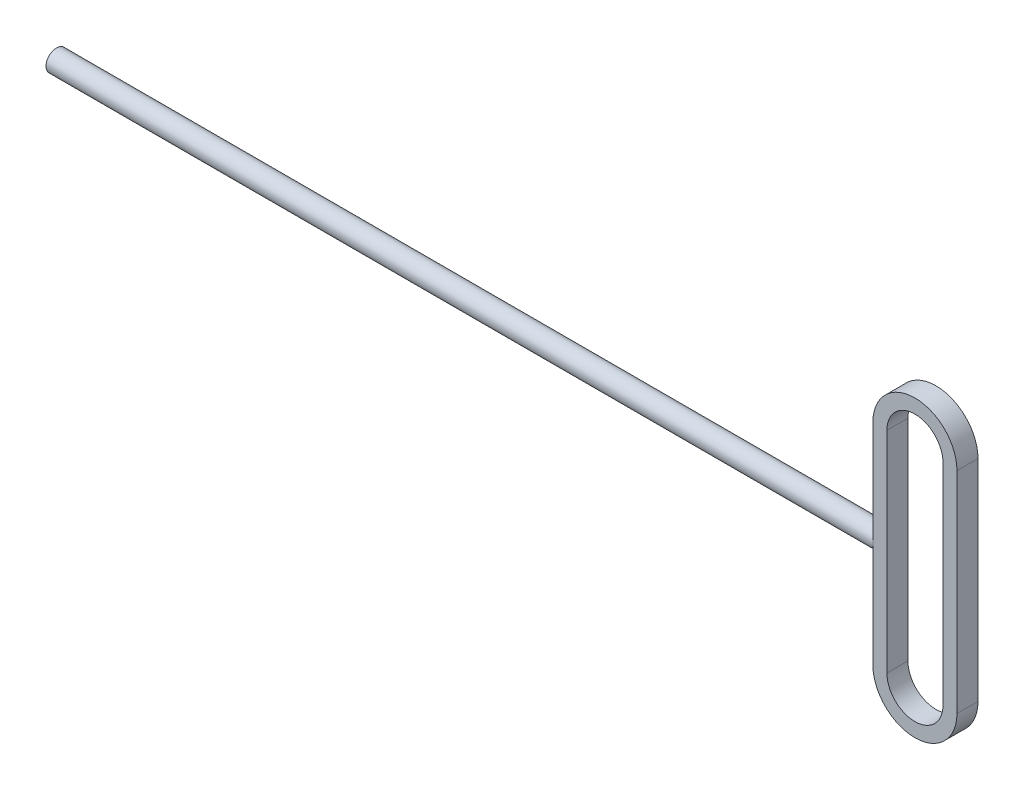
ISO-10303-21;
HEADER;
FILE_DESCRIPTION(('STEP AP214'),'2;1');
FILE_NAME('part.step','',(''),(''),'','','');
FILE_SCHEMA(('AUTOMOTIVE_DESIGN { 1 0 10303 214 1 1 1 1 }'));
ENDSEC;
DATA;
#1=APPLICATION_CONTEXT('core data for automotive mechanical design processes');
#2=APPLICATION_PROTOCOL_DEFINITION('international standard','automotive_design',2000,#1);
#3=PRODUCT_CONTEXT('',#1,'mechanical');
#4=PRODUCT('Part','Part','',(#3));
#5=PRODUCT_RELATED_PRODUCT_CATEGORY('part','',(#4));
#6=PRODUCT_DEFINITION_FORMATION('','',#4);
#7=PRODUCT_DEFINITION_CONTEXT('part definition',#1,'design');
#8=PRODUCT_DEFINITION('design','',#6,#7);
#9=PRODUCT_DEFINITION_SHAPE('','',#8);
#10=(LENGTH_UNIT() NAMED_UNIT(*) SI_UNIT(.MILLI.,.METRE.));
#11=(NAMED_UNIT(*) PLANE_ANGLE_UNIT() SI_UNIT($,.RADIAN.));
#12=(NAMED_UNIT(*) SI_UNIT($,.STERADIAN.) SOLID_ANGLE_UNIT());
#13=UNCERTAINTY_MEASURE_WITH_UNIT(LENGTH_MEASURE(1.E-05),#10,'distance_accuracy_value','');
#14=(GEOMETRIC_REPRESENTATION_CONTEXT(3) GLOBAL_UNCERTAINTY_ASSIGNED_CONTEXT((#13)) GLOBAL_UNIT_ASSIGNED_CONTEXT((#10,
#11,#12)) REPRESENTATION_CONTEXT('',''));
#15=CARTESIAN_POINT('',(0.,0.,0.));
#16=DIRECTION('',(0.,0.,1.));
#17=DIRECTION('',(1.,0.,0.));
#18=AXIS2_PLACEMENT_3D('',#15,#16,#17);
#19=CARTESIAN_POINT('',(-2.,-29.7611568837199,3.));
#20=DIRECTION('',(1.,0.,0.));
#21=DIRECTION('',(0.,1.,0.));
#22=AXIS2_PLACEMENT_3D('',#19,#20,#21);
#23=PLANE('',#22);
#24=CARTESIAN_POINT('',(-2.,-44.7611568837199,1.5));
#25=DIRECTION('',(1.,0.,0.));
#26=DIRECTION('',(0.,1.,0.));
#27=AXIS2_PLACEMENT_3D('',#24,#25,#26);
#28=CIRCLE('',#27,1.5);
#29=CARTESIAN_POINT('',(-2.,-44.7611568837199,0.));
#30=VERTEX_POINT('',#29);
#31=CARTESIAN_POINT('',(-2.,-44.7611568837199,3.));
#32=VERTEX_POINT('',#31);
#33=EDGE_CURVE('E124',#30,#32,#28,.F.);
#34=ORIENTED_EDGE('',*,*,#33,.F.);
#35=DIRECTION('',(0.,-1.,0.));
#36=VECTOR('',#35,1.);
#37=CARTESIAN_POINT('',(-2.,-29.7611568837199,0.));
#38=LINE('',#37,#36);
#39=CARTESIAN_POINT('',(-2.00000000000001,-59.7611568837199,0.));
#40=VERTEX_POINT('',#39);
#41=EDGE_CURVE('E113',#30,#40,#38,.T.);
#42=ORIENTED_EDGE('',*,*,#41,.T.);
#43=DIRECTION('',(0.,0.,-1.));
#44=VECTOR('',#43,1.);
#45=CARTESIAN_POINT('',(-2.00000000000001,-59.7611568837199,3.));
#46=LINE('',#45,#44);
#47=CARTESIAN_POINT('',(-2.00000000000001,-59.7611568837199,3.));
#48=VERTEX_POINT('',#47);
#49=EDGE_CURVE('E45',#48,#40,#46,.T.);
#50=ORIENTED_EDGE('',*,*,#49,.F.);
#51=DIRECTION('',(0.,-1.,0.));
#52=VECTOR('',#51,1.);
#53=CARTESIAN_POINT('',(-2.,-29.7611568837199,3.));
#54=LINE('',#53,#52);
#55=EDGE_CURVE('E125',#32,#48,#54,.T.);
#56=ORIENTED_EDGE('',*,*,#55,.F.);
#57=EDGE_LOOP('',(#34,#42,#50,#56));
#58=FACE_BOUND('',#57,.T.);
#59=ADVANCED_FACE('F37',(#58),#23,.F.);
#60=EDGE_CURVE('E52',#32,#30,#28,.F.);
#61=ORIENTED_EDGE('',*,*,#60,.F.);
#62=CARTESIAN_POINT('',(-2.,-29.7611568837199,3.));
#63=VERTEX_POINT('',#62);
#64=EDGE_CURVE('E166',#63,#32,#54,.T.);
#65=ORIENTED_EDGE('',*,*,#64,.F.);
#66=DIRECTION('',(0.,0.,-1.));
#67=VECTOR('',#66,1.);
#68=CARTESIAN_POINT('',(-2.,-29.7611568837199,3.));
#69=LINE('',#68,#67);
#70=CARTESIAN_POINT('',(-2.,-29.7611568837199,0.));
#71=VERTEX_POINT('',#70);
#72=EDGE_CURVE('E12',#63,#71,#69,.T.);
#73=ORIENTED_EDGE('',*,*,#72,.T.);
#74=EDGE_CURVE('E105',#71,#30,#38,.T.);
#75=ORIENTED_EDGE('',*,*,#74,.T.);
#76=EDGE_LOOP('',(#61,#65,#73,#75));
#77=FACE_BOUND('',#76,.T.);
#78=ADVANCED_FACE('F107',(#77),#23,.F.);
#79=CARTESIAN_POINT('',(4.,-29.7611568837199,3.));
#80=DIRECTION('',(0.,0.,1.));
#81=DIRECTION('',(1.,0.,0.));
#82=AXIS2_PLACEMENT_3D('',#79,#80,#81);
#83=PLANE('',#82);
#84=CARTESIAN_POINT('',(3.99999999999999,-59.7611568837199,3.));
#85=DIRECTION('',(0.,0.,1.));
#86=DIRECTION('',(1.,0.,0.));
#87=AXIS2_PLACEMENT_3D('',#84,#85,#86);
#88=CIRCLE('',#87,4.);
#89=CARTESIAN_POINT('',(0.,-59.7611568837199,3.));
#90=VERTEX_POINT('',#89);
#91=CARTESIAN_POINT('',(8.00000000000001,-59.7611568837199,3.));
#92=VERTEX_POINT('',#91);
#93=EDGE_CURVE('E135',#90,#92,#88,.T.);
#94=ORIENTED_EDGE('',*,*,#93,.F.);
#95=DIRECTION('',(0.,-1.,0.));
#96=VECTOR('',#95,1.);
#97=CARTESIAN_POINT('',(0.,-29.7611568837199,3.));
#98=LINE('',#97,#96);
#99=CARTESIAN_POINT('',(0.,-29.7611568837199,3.));
#100=VERTEX_POINT('',#99);
#101=EDGE_CURVE('E142',#100,#90,#98,.T.);
#102=ORIENTED_EDGE('',*,*,#101,.F.);
#103=CARTESIAN_POINT('',(4.,-29.7611568837199,3.));
#104=DIRECTION('',(0.,0.,1.));
#105=DIRECTION('',(1.,0.,0.));
#106=AXIS2_PLACEMENT_3D('',#103,#104,#105);
#107=CIRCLE('',#106,4.);
#108=CARTESIAN_POINT('',(8.00000000000001,-29.7611568837199,3.));
#109=VERTEX_POINT('',#108);
#110=EDGE_CURVE('E140',#109,#100,#107,.T.);
#111=ORIENTED_EDGE('',*,*,#110,.F.);
#112=DIRECTION('',(0.,1.,0.));
#113=VECTOR('',#112,1.);
#114=CARTESIAN_POINT('',(8.00000000000001,-29.7611568837199,3.));
#115=LINE('',#114,#113);
#116=EDGE_CURVE('E137',#92,#109,#115,.T.);
#117=ORIENTED_EDGE('',*,*,#116,.F.);
#118=EDGE_LOOP('',(#94,#102,#111,#117));
#119=FACE_BOUND('',#118,.T.);
#120=CARTESIAN_POINT('',(4.,-29.7611568837199,3.));
#121=DIRECTION('',(0.,0.,1.));
#122=DIRECTION('',(1.,0.,0.));
#123=AXIS2_PLACEMENT_3D('',#120,#121,#122);
#124=CIRCLE('',#123,6.);
#125=CARTESIAN_POINT('',(10.,-29.7611568837199,3.));
#126=VERTEX_POINT('',#125);
#127=EDGE_CURVE('E162',#126,#63,#124,.T.);
#128=ORIENTED_EDGE('',*,*,#127,.T.);
#129=ORIENTED_EDGE('',*,*,#64,.T.);
#130=ORIENTED_EDGE('',*,*,#55,.T.);
#131=CARTESIAN_POINT('',(3.99999999999999,-59.7611568837199,3.));
#132=DIRECTION('',(0.,0.,1.));
#133=DIRECTION('',(1.,0.,0.));
#134=AXIS2_PLACEMENT_3D('',#131,#132,#133);
#135=CIRCLE('',#134,6.);
#136=CARTESIAN_POINT('',(9.99999999999999,-59.7611568837199,3.));
#137=VERTEX_POINT('',#136);
#138=EDGE_CURVE('E168',#48,#137,#135,.T.);
#139=ORIENTED_EDGE('',*,*,#138,.T.);
#140=DIRECTION('',(0.,1.,0.));
#141=VECTOR('',#140,1.);
#142=CARTESIAN_POINT('',(10.,-29.7611568837199,3.));
#143=LINE('',#142,#141);
#144=EDGE_CURVE('E170',#137,#126,#143,.T.);
#145=ORIENTED_EDGE('',*,*,#144,.T.);
#146=EDGE_LOOP('',(#128,#129,#130,#139,#145));
#147=FACE_BOUND('',#146,.T.);
#148=ADVANCED_FACE('F186',(#119,#147),#83,.T.);
#149=CARTESIAN_POINT('',(4.,-29.7611568837199,0.));
#150=DIRECTION('',(0.,0.,1.));
#151=DIRECTION('',(1.,0.,0.));
#152=AXIS2_PLACEMENT_3D('',#149,#150,#151);
#153=PLANE('',#152);
#154=DIRECTION('',(0.,-1.,0.));
#155=VECTOR('',#154,1.);
#156=CARTESIAN_POINT('',(0.,-29.7611568837199,0.));
#157=LINE('',#156,#155);
#158=CARTESIAN_POINT('',(0.,-29.7611568837199,0.));
#159=VERTEX_POINT('',#158);
#160=CARTESIAN_POINT('',(0.,-59.7611568837199,0.));
#161=VERTEX_POINT('',#160);
#162=EDGE_CURVE('E138',#159,#161,#157,.T.);
#163=ORIENTED_EDGE('',*,*,#162,.T.);
#164=CARTESIAN_POINT('',(3.99999999999999,-59.7611568837199,0.));
#165=DIRECTION('',(0.,0.,1.));
#166=DIRECTION('',(1.,0.,0.));
#167=AXIS2_PLACEMENT_3D('',#164,#165,#166);
#168=CIRCLE('',#167,4.);
#169=CARTESIAN_POINT('',(8.00000000000001,-59.7611568837199,0.));
#170=VERTEX_POINT('',#169);
#171=EDGE_CURVE('E128',#161,#170,#168,.T.);
#172=ORIENTED_EDGE('',*,*,#171,.T.);
#173=DIRECTION('',(0.,1.,0.));
#174=VECTOR('',#173,1.);
#175=CARTESIAN_POINT('',(8.00000000000001,-29.7611568837199,0.));
#176=LINE('',#175,#174);
#177=CARTESIAN_POINT('',(8.00000000000001,-29.7611568837199,0.));
#178=VERTEX_POINT('',#177);
#179=EDGE_CURVE('E147',#170,#178,#176,.T.);
#180=ORIENTED_EDGE('',*,*,#179,.T.);
#181=CARTESIAN_POINT('',(4.,-29.7611568837199,0.));
#182=DIRECTION('',(0.,0.,1.));
#183=DIRECTION('',(1.,0.,0.));
#184=AXIS2_PLACEMENT_3D('',#181,#182,#183);
#185=CIRCLE('',#184,4.);
#186=EDGE_CURVE('E150',#178,#159,#185,.T.);
#187=ORIENTED_EDGE('',*,*,#186,.T.);
#188=EDGE_LOOP('',(#163,#172,#180,#187));
#189=FACE_BOUND('',#188,.T.);
#190=CARTESIAN_POINT('',(4.,-29.7611568837199,0.));
#191=DIRECTION('',(0.,0.,1.));
#192=DIRECTION('',(1.,0.,0.));
#193=AXIS2_PLACEMENT_3D('',#190,#191,#192);
#194=CIRCLE('',#193,6.);
#195=CARTESIAN_POINT('',(10.,-29.7611568837199,0.));
#196=VERTEX_POINT('',#195);
#197=EDGE_CURVE('E122',#196,#71,#194,.T.);
#198=ORIENTED_EDGE('',*,*,#197,.F.);
#199=DIRECTION('',(0.,1.,0.));
#200=VECTOR('',#199,1.);
#201=CARTESIAN_POINT('',(10.,-29.7611568837199,0.));
#202=LINE('',#201,#200);
#203=CARTESIAN_POINT('',(9.99999999999999,-59.7611568837199,0.));
#204=VERTEX_POINT('',#203);
#205=EDGE_CURVE('E165',#204,#196,#202,.T.);
#206=ORIENTED_EDGE('',*,*,#205,.F.);
#207=CARTESIAN_POINT('',(3.99999999999999,-59.7611568837199,0.));
#208=DIRECTION('',(0.,0.,1.));
#209=DIRECTION('',(1.,0.,0.));
#210=AXIS2_PLACEMENT_3D('',#207,#208,#209);
#211=CIRCLE('',#210,6.);
#212=EDGE_CURVE('E112',#40,#204,#211,.T.);
#213=ORIENTED_EDGE('',*,*,#212,.F.);
#214=ORIENTED_EDGE('',*,*,#41,.F.);
#215=ORIENTED_EDGE('',*,*,#74,.F.);
#216=EDGE_LOOP('',(#198,#206,#213,#214,#215));
#217=FACE_BOUND('',#216,.T.);
#218=ADVANCED_FACE('F117',(#189,#217),#153,.F.);
#219=CARTESIAN_POINT('',(4.,-29.7611568837199,3.));
#220=DIRECTION('',(0.,0.,-1.));
#221=DIRECTION('',(-1.,0.,0.));
#222=AXIS2_PLACEMENT_3D('',#219,#220,#221);
#223=CYLINDRICAL_SURFACE('',#222,6.);
#224=ORIENTED_EDGE('',*,*,#197,.T.);
#225=ORIENTED_EDGE('',*,*,#72,.F.);
#226=ORIENTED_EDGE('',*,*,#127,.F.);
#227=DIRECTION('',(0.,0.,-1.));
#228=VECTOR('',#227,1.);
#229=CARTESIAN_POINT('',(10.,-29.7611568837199,3.));
#230=LINE('',#229,#228);
#231=EDGE_CURVE('E172',#126,#196,#230,.T.);
#232=ORIENTED_EDGE('',*,*,#231,.T.);
#233=EDGE_LOOP('',(#224,#225,#226,#232));
#234=FACE_BOUND('',#233,.T.);
#235=ADVANCED_FACE('F39',(#234),#223,.T.);
#236=CARTESIAN_POINT('',(3.99999999999999,-59.7611568837199,3.));
#237=DIRECTION('',(0.,0.,-1.));
#238=DIRECTION('',(-1.,0.,0.));
#239=AXIS2_PLACEMENT_3D('',#236,#237,#238);
#240=CYLINDRICAL_SURFACE('',#239,6.);
#241=ORIENTED_EDGE('',*,*,#212,.T.);
#242=DIRECTION('',(0.,0.,-1.));
#243=VECTOR('',#242,1.);
#244=CARTESIAN_POINT('',(9.99999999999999,-59.7611568837199,3.));
#245=LINE('',#244,#243);
#246=EDGE_CURVE('E178',#137,#204,#245,.T.);
#247=ORIENTED_EDGE('',*,*,#246,.F.);
#248=ORIENTED_EDGE('',*,*,#138,.F.);
#249=ORIENTED_EDGE('',*,*,#49,.T.);
#250=EDGE_LOOP('',(#241,#247,#248,#249));
#251=FACE_BOUND('',#250,.T.);
#252=ADVANCED_FACE('F182',(#251),#240,.T.);
#253=CARTESIAN_POINT('',(10.,-29.7611568837199,3.));
#254=DIRECTION('',(-1.,0.,0.));
#255=DIRECTION('',(0.,-1.,0.));
#256=AXIS2_PLACEMENT_3D('',#253,#254,#255);
#257=PLANE('',#256);
#258=ORIENTED_EDGE('',*,*,#205,.T.);
#259=ORIENTED_EDGE('',*,*,#231,.F.);
#260=ORIENTED_EDGE('',*,*,#144,.F.);
#261=ORIENTED_EDGE('',*,*,#246,.T.);
#262=EDGE_LOOP('',(#258,#259,#260,#261));
#263=FACE_BOUND('',#262,.T.);
#264=ADVANCED_FACE('F191',(#263),#257,.F.);
#265=CARTESIAN_POINT('',(3.99999999999999,-59.7611568837199,3.));
#266=DIRECTION('',(0.,0.,-1.));
#267=DIRECTION('',(-1.,0.,0.));
#268=AXIS2_PLACEMENT_3D('',#265,#266,#267);
#269=CYLINDRICAL_SURFACE('',#268,4.);
#270=ORIENTED_EDGE('',*,*,#171,.F.);
#271=DIRECTION('',(0.,0.,-1.));
#272=VECTOR('',#271,1.);
#273=CARTESIAN_POINT('',(0.,-59.7611568837199,3.));
#274=LINE('',#273,#272);
#275=EDGE_CURVE('E144',#90,#161,#274,.T.);
#276=ORIENTED_EDGE('',*,*,#275,.F.);
#277=ORIENTED_EDGE('',*,*,#93,.T.);
#278=DIRECTION('',(0.,0.,-1.));
#279=VECTOR('',#278,1.);
#280=CARTESIAN_POINT('',(8.00000000000001,-59.7611568837199,3.));
#281=LINE('',#280,#279);
#282=EDGE_CURVE('E159',#92,#170,#281,.T.);
#283=ORIENTED_EDGE('',*,*,#282,.T.);
#284=EDGE_LOOP('',(#270,#276,#277,#283));
#285=FACE_BOUND('',#284,.T.);
#286=ADVANCED_FACE('F193',(#285),#269,.F.);
#287=CARTESIAN_POINT('',(8.00000000000001,-29.7611568837199,3.));
#288=DIRECTION('',(-1.,0.,0.));
#289=DIRECTION('',(0.,0.,1.));
#290=AXIS2_PLACEMENT_3D('',#287,#288,#289);
#291=PLANE('',#290);
#292=ORIENTED_EDGE('',*,*,#179,.F.);
#293=ORIENTED_EDGE('',*,*,#282,.F.);
#294=ORIENTED_EDGE('',*,*,#116,.T.);
#295=DIRECTION('',(0.,0.,-1.));
#296=VECTOR('',#295,1.);
#297=CARTESIAN_POINT('',(8.00000000000001,-29.7611568837199,3.));
#298=LINE('',#297,#296);
#299=EDGE_CURVE('E157',#109,#178,#298,.T.);
#300=ORIENTED_EDGE('',*,*,#299,.T.);
#301=EDGE_LOOP('',(#292,#293,#294,#300));
#302=FACE_BOUND('',#301,.T.);
#303=ADVANCED_FACE('F199',(#302),#291,.T.);
#304=CARTESIAN_POINT('',(4.,-29.7611568837199,3.));
#305=DIRECTION('',(0.,0.,-1.));
#306=DIRECTION('',(-1.,0.,0.));
#307=AXIS2_PLACEMENT_3D('',#304,#305,#306);
#308=CYLINDRICAL_SURFACE('',#307,4.);
#309=ORIENTED_EDGE('',*,*,#186,.F.);
#310=ORIENTED_EDGE('',*,*,#299,.F.);
#311=ORIENTED_EDGE('',*,*,#110,.T.);
#312=DIRECTION('',(0.,0.,-1.));
#313=VECTOR('',#312,1.);
#314=CARTESIAN_POINT('',(0.,-29.7611568837199,3.));
#315=LINE('',#314,#313);
#316=EDGE_CURVE('E60',#100,#159,#315,.T.);
#317=ORIENTED_EDGE('',*,*,#316,.T.);
#318=EDGE_LOOP('',(#309,#310,#311,#317));
#319=FACE_BOUND('',#318,.T.);
#320=ADVANCED_FACE('F221',(#319),#308,.F.);
#321=CARTESIAN_POINT('',(0.,-29.7611568837199,3.));
#322=DIRECTION('',(1.,0.,0.));
#323=DIRECTION('',(0.,1.,0.));
#324=AXIS2_PLACEMENT_3D('',#321,#322,#323);
#325=PLANE('',#324);
#326=ORIENTED_EDGE('',*,*,#101,.T.);
#327=ORIENTED_EDGE('',*,*,#275,.T.);
#328=ORIENTED_EDGE('',*,*,#162,.F.);
#329=ORIENTED_EDGE('',*,*,#316,.F.);
#330=EDGE_LOOP('',(#326,#327,#328,#329));
#331=FACE_BOUND('',#330,.T.);
#332=ADVANCED_FACE('F225',(#331),#325,.T.);
#333=CARTESIAN_POINT('',(0.,-44.7611568837199,1.5));
#334=DIRECTION('',(-1.,0.,0.));
#335=DIRECTION('',(0.,-1.,0.));
#336=AXIS2_PLACEMENT_3D('',#333,#334,#335);
#337=CYLINDRICAL_SURFACE('',#336,1.5);
#338=CARTESIAN_POINT('',(-120.,-44.7611568837198,1.5));
#339=DIRECTION('',(1.,0.,0.));
#340=DIRECTION('',(0.,0.,-1.));
#341=AXIS2_PLACEMENT_3D('',#338,#339,#340);
#342=CIRCLE('',#341,1.5);
#343=CARTESIAN_POINT('',(-120.,-44.7611568837198,0.));
#344=VERTEX_POINT('',#343);
#345=EDGE_CURVE('E131',#344,#344,#342,.T.);
#346=ORIENTED_EDGE('',*,*,#345,.T.);
#347=EDGE_LOOP('',(#346));
#348=FACE_BOUND('',#347,.T.);
#349=ORIENTED_EDGE('',*,*,#60,.T.);
#350=ORIENTED_EDGE('',*,*,#33,.T.);
#351=EDGE_LOOP('',(#349,#350));
#352=FACE_BOUND('',#351,.T.);
#353=ADVANCED_FACE('F130',(#348,#352),#337,.T.);
#354=CARTESIAN_POINT('',(-120.,0.,0.));
#355=DIRECTION('',(-1.,0.,0.));
#356=DIRECTION('',(0.,0.,1.));
#357=AXIS2_PLACEMENT_3D('',#354,#355,#356);
#358=PLANE('',#357);
#359=ORIENTED_EDGE('',*,*,#345,.F.);
#360=EDGE_LOOP('',(#359));
#361=FACE_BOUND('',#360,.T.);
#362=ADVANCED_FACE('F229',(#361),#358,.T.);
#363=CLOSED_SHELL('',(#59,#78,#148,#218,#235,#252,#264,#286,#303,#320,#332,#353,#362));
#364=MANIFOLD_SOLID_BREP('B2',#363);
#365=ADVANCED_BREP_SHAPE_REPRESENTATION('',(#18,#364),#14);
#366=SHAPE_DEFINITION_REPRESENTATION(#9,#365);
ENDSEC;
END-ISO-10303-21;
